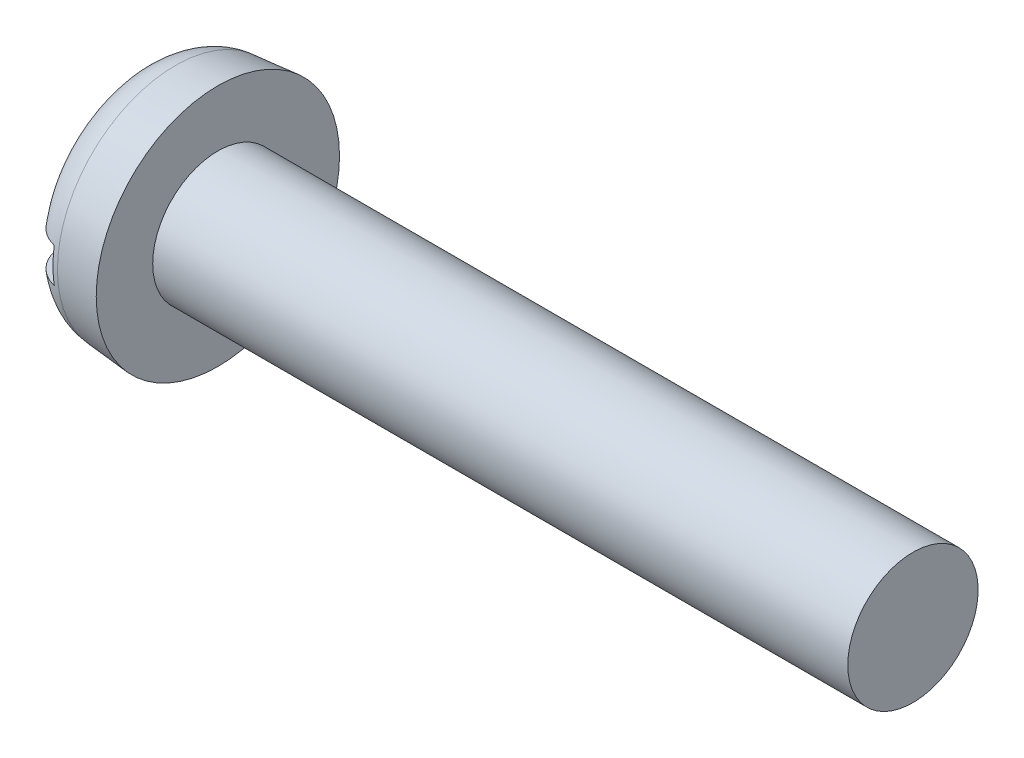
ISO-10303-21;
HEADER;
FILE_DESCRIPTION(('STEP AP214'),'2;1');
FILE_NAME('part.step','',(''),(''),'','','');
FILE_SCHEMA(('AUTOMOTIVE_DESIGN { 1 0 10303 214 1 1 1 1 }'));
ENDSEC;
DATA;
#1=APPLICATION_CONTEXT('core data for automotive mechanical design processes');
#2=APPLICATION_PROTOCOL_DEFINITION('international standard','automotive_design',2000,#1);
#3=PRODUCT_CONTEXT('',#1,'mechanical');
#4=PRODUCT('Part','Part','',(#3));
#5=PRODUCT_RELATED_PRODUCT_CATEGORY('part','',(#4));
#6=PRODUCT_DEFINITION_FORMATION('','',#4);
#7=PRODUCT_DEFINITION_CONTEXT('part definition',#1,'design');
#8=PRODUCT_DEFINITION('design','',#6,#7);
#9=PRODUCT_DEFINITION_SHAPE('','',#8);
#10=(LENGTH_UNIT() NAMED_UNIT(*) SI_UNIT(.MILLI.,.METRE.));
#11=(NAMED_UNIT(*) PLANE_ANGLE_UNIT() SI_UNIT($,.RADIAN.));
#12=(NAMED_UNIT(*) SI_UNIT($,.STERADIAN.) SOLID_ANGLE_UNIT());
#13=UNCERTAINTY_MEASURE_WITH_UNIT(LENGTH_MEASURE(1.E-05),#10,'distance_accuracy_value','');
#14=(GEOMETRIC_REPRESENTATION_CONTEXT(3) GLOBAL_UNCERTAINTY_ASSIGNED_CONTEXT((#13)) GLOBAL_UNIT_ASSIGNED_CONTEXT((#10,
#11,#12)) REPRESENTATION_CONTEXT('',''));
#15=CARTESIAN_POINT('',(0.,0.,0.));
#16=DIRECTION('',(0.,0.,1.));
#17=DIRECTION('',(1.,0.,0.));
#18=AXIS2_PLACEMENT_3D('',#15,#16,#17);
#19=CARTESIAN_POINT('',(0.,0.,0.));
#20=DIRECTION('',(-1.,0.,0.));
#21=DIRECTION('',(0.,0.,1.));
#22=AXIS2_PLACEMENT_3D('',#19,#20,#21);
#23=PLANE('',#22);
#24=DIRECTION('',(0.,0.,-1.));
#25=VECTOR('',#24,1.);
#26=CARTESIAN_POINT('',(0.,0.4,2.8));
#27=LINE('',#26,#25);
#28=CARTESIAN_POINT('',(0.,0.4,1.77326763142532));
#29=VERTEX_POINT('',#28);
#30=CARTESIAN_POINT('',(0.,0.4,-1.77326763142532));
#31=VERTEX_POINT('',#30);
#32=EDGE_CURVE('E88',#29,#31,#27,.T.);
#33=ORIENTED_EDGE('',*,*,#32,.F.);
#34=CARTESIAN_POINT('',(0.,0.,0.));
#35=DIRECTION('',(-1.,0.,0.));
#36=DIRECTION('',(0.,0.,1.));
#37=AXIS2_PLACEMENT_3D('',#34,#35,#36);
#38=CIRCLE('',#37,1.81782234903766);
#39=EDGE_CURVE('E94',#29,#31,#38,.T.);
#40=ORIENTED_EDGE('',*,*,#39,.T.);
#41=EDGE_LOOP('',(#33,#40));
#42=FACE_BOUND('',#41,.T.);
#43=ADVANCED_FACE('F35',(#42),#23,.T.);
#44=CARTESIAN_POINT('',(-25.4,0.,0.));
#45=DIRECTION('',(-1.,0.,0.));
#46=DIRECTION('',(0.,0.,1.));
#47=AXIS2_PLACEMENT_3D('',#44,#45,#46);
#48=CYLINDRICAL_SURFACE('',#47,1.5);
#49=CARTESIAN_POINT('',(17.8,0.,0.));
#50=DIRECTION('',(-1.,0.,0.));
#51=DIRECTION('',(0.,0.,1.));
#52=AXIS2_PLACEMENT_3D('',#49,#50,#51);
#53=CIRCLE('',#52,1.5);
#54=CARTESIAN_POINT('',(17.8,0.,1.5));
#55=VERTEX_POINT('',#54);
#56=EDGE_CURVE('E95',#55,#55,#53,.T.);
#57=ORIENTED_EDGE('',*,*,#56,.T.);
#58=EDGE_LOOP('',(#57));
#59=FACE_BOUND('',#58,.T.);
#60=CARTESIAN_POINT('',(1.8,0.,0.));
#61=DIRECTION('',(-1.,0.,0.));
#62=DIRECTION('',(0.,0.,1.));
#63=AXIS2_PLACEMENT_3D('',#60,#61,#62);
#64=CIRCLE('',#63,1.5);
#65=CARTESIAN_POINT('',(1.8,0.,1.5));
#66=VERTEX_POINT('',#65);
#67=EDGE_CURVE('E152',#66,#66,#64,.T.);
#68=ORIENTED_EDGE('',*,*,#67,.F.);
#69=EDGE_LOOP('',(#68));
#70=FACE_BOUND('',#69,.T.);
#71=ADVANCED_FACE('F140',(#59,#70),#48,.T.);
#72=CARTESIAN_POINT('',(17.8,1.5,0.));
#73=DIRECTION('',(1.,0.,0.));
#74=DIRECTION('',(0.,0.,-1.));
#75=AXIS2_PLACEMENT_3D('',#72,#73,#74);
#76=PLANE('',#75);
#77=ORIENTED_EDGE('',*,*,#56,.F.);
#78=EDGE_LOOP('',(#77));
#79=FACE_BOUND('',#78,.T.);
#80=ADVANCED_FACE('F138',(#79),#76,.T.);
#81=DIRECTION('',(0.,0.,1.));
#82=VECTOR('',#81,1.);
#83=CARTESIAN_POINT('',(0.,-0.4,-2.8));
#84=LINE('',#83,#82);
#85=CARTESIAN_POINT('',(0.,-0.4,-1.77326763142532));
#86=VERTEX_POINT('',#85);
#87=CARTESIAN_POINT('',(0.,-0.4,1.77326763142532));
#88=VERTEX_POINT('',#87);
#89=EDGE_CURVE('E79',#86,#88,#84,.T.);
#90=ORIENTED_EDGE('',*,*,#89,.F.);
#91=EDGE_CURVE('E86',#86,#88,#38,.T.);
#92=ORIENTED_EDGE('',*,*,#91,.T.);
#93=EDGE_LOOP('',(#90,#92));
#94=FACE_BOUND('',#93,.T.);
#95=ADVANCED_FACE('F85',(#94),#23,.T.);
#96=CARTESIAN_POINT('',(0.,0.,0.));
#97=DIRECTION('',(1.,0.,0.));
#98=DIRECTION('',(0.,0.,-1.));
#99=AXIS2_PLACEMENT_3D('',#96,#97,#98);
#100=CONICAL_SURFACE('',#99,2.64252040565334,0.0872664625997168);
#101=CARTESIAN_POINT('',(0.821559831527111,0.,0.));
#102=DIRECTION('',(-1.,0.,0.));
#103=DIRECTION('',(0.,0.,1.));
#104=AXIS2_PLACEMENT_3D('',#101,#102,#103);
#105=CIRCLE('',#104,2.71439757732023);
#106=CARTESIAN_POINT('',(0.821559831527111,0.,2.71439757732023));
#107=VERTEX_POINT('',#106);
#108=EDGE_CURVE('E98',#107,#107,#105,.F.);
#109=ORIENTED_EDGE('',*,*,#108,.T.);
#110=EDGE_LOOP('',(#109));
#111=FACE_BOUND('',#110,.T.);
#112=CARTESIAN_POINT('',(1.8,0.,0.));
#113=DIRECTION('',(-1.,0.,0.));
#114=DIRECTION('',(0.,0.,1.));
#115=AXIS2_PLACEMENT_3D('',#112,#113,#114);
#116=CIRCLE('',#115,2.8);
#117=CARTESIAN_POINT('',(1.8,0.,2.8));
#118=VERTEX_POINT('',#117);
#119=EDGE_CURVE('E100',#118,#118,#116,.T.);
#120=ORIENTED_EDGE('',*,*,#119,.T.);
#121=EDGE_LOOP('',(#120));
#122=FACE_BOUND('',#121,.T.);
#123=ADVANCED_FACE('F131',(#111,#122),#100,.T.);
#124=CARTESIAN_POINT('',(1.8,1.5,0.));
#125=DIRECTION('',(-1.,0.,0.));
#126=DIRECTION('',(0.,0.,1.));
#127=AXIS2_PLACEMENT_3D('',#124,#125,#126);
#128=PLANE('',#127);
#129=ORIENTED_EDGE('',*,*,#119,.F.);
#130=EDGE_LOOP('',(#129));
#131=FACE_BOUND('',#130,.T.);
#132=ORIENTED_EDGE('',*,*,#67,.T.);
#133=EDGE_LOOP('',(#132));
#134=FACE_BOUND('',#133,.T.);
#135=ADVANCED_FACE('F127',(#131,#134),#128,.F.);
#136=CARTESIAN_POINT('',(0.9,0.,0.));
#137=DIRECTION('',(-1.,0.,0.));
#138=DIRECTION('',(0.,0.,1.));
#139=AXIS2_PLACEMENT_3D('',#136,#137,#138);
#140=TOROIDAL_SURFACE('',#139,1.81782234903766,0.9);
#141=CARTESIAN_POINT('',(0.285780762477817,0.4,-2.44311963508101));
#142=CARTESIAN_POINT('',(0.322325244969282,0.4,-2.47769297217772));
#143=CARTESIAN_POINT('',(0.361794878156767,0.4,-2.50922544126929));
#144=CARTESIAN_POINT('',(0.445493757535043,0.4,-2.56525291577746));
#145=CARTESIAN_POINT('',(0.48972822484029,0.4,-2.58974009118149));
#146=CARTESIAN_POINT('',(0.581685294636184,0.4,-2.63091846199156));
#147=CARTESIAN_POINT('',(0.629407305379898,0.4,-2.64761097641683));
#148=CARTESIAN_POINT('',(0.726972312257169,0.4,-2.67270033258514));
#149=CARTESIAN_POINT('',(0.776814803129367,0.4,-2.68109913910669));
#150=CARTESIAN_POINT('',(0.876977038697279,0.4,-2.68933922206438));
#151=CARTESIAN_POINT('',(0.92729364560996,0.4,-2.68921866149007));
#152=CARTESIAN_POINT('',(1.02719093347253,0.4,-2.68051830929739));
#153=CARTESIAN_POINT('',(1.07677160162593,0.4,-2.67193837076201));
#154=CARTESIAN_POINT('',(1.17371760664879,0.4,-2.6465919807109));
#155=CARTESIAN_POINT('',(1.2210859954371,0.4,-2.62983719558013));
#156=CARTESIAN_POINT('',(1.31235127069059,0.4,-2.58864040768255));
#157=CARTESIAN_POINT('',(1.35624813968071,0.4,-2.56419836622246));
#158=CARTESIAN_POINT('',(1.43950339303332,0.4,-2.50824069345436));
#159=CARTESIAN_POINT('',(1.47884484993389,0.4,-2.47669988555644));
#160=CARTESIAN_POINT('',(1.55173067508121,0.4,-2.40751412200212));
#161=CARTESIAN_POINT('',(1.5852748745774,0.4,-2.36986898871862));
#162=CARTESIAN_POINT('',(1.64594872274809,0.4,-2.28919528368316));
#163=CARTESIAN_POINT('',(1.67301846569636,0.4,-2.24612167422176));
#164=CARTESIAN_POINT('',(1.71966197411636,0.4,-2.15609376898817));
#165=CARTESIAN_POINT('',(1.73923530584546,0.4,-2.10913924885738));
#166=CARTESIAN_POINT('',(1.77066025907209,0.4,-2.01194193646076));
#167=CARTESIAN_POINT('',(1.78239254664628,0.4,-1.96166058810882));
#168=CARTESIAN_POINT('',(1.7974373595853,0.4,-1.85985639013623));
#169=CARTESIAN_POINT('',(1.80074908437145,0.4,-1.80833342293966));
#170=CARTESIAN_POINT('',(1.79894832980293,0.4,-1.70434405475568));
#171=CARTESIAN_POINT('',(1.79365584590562,0.4,-1.651880798299));
#172=CARTESIAN_POINT('',(1.77456092354076,0.4,-1.54852841034414));
#173=CARTESIAN_POINT('',(1.76075741543224,0.4,-1.49763947754675));
#174=CARTESIAN_POINT('',(1.7246504916629,0.4,-1.3975266769579));
#175=CARTESIAN_POINT('',(1.70214283236717,0.4,-1.34837644263265));
#176=CARTESIAN_POINT('',(1.64933120824444,0.4,-1.25444995564252));
#177=CARTESIAN_POINT('',(1.6190255468442,0.4,-1.20967465773975));
#178=CARTESIAN_POINT('',(1.55085214424215,0.4,-1.12504927254803));
#179=CARTESIAN_POINT('',(1.51286662510254,0.4,-1.08529386793689));
#180=CARTESIAN_POINT('',(1.4306134165613,0.4,-1.01288372669284));
#181=CARTESIAN_POINT('',(1.38634513970435,0.4,-0.98022965477811));
#182=CARTESIAN_POINT('',(1.29378824575784,0.4,-0.924048107397016));
#183=CARTESIAN_POINT('',(1.24562231583718,0.4,-0.900319541839471));
#184=CARTESIAN_POINT('',(1.14574424072186,0.4,-0.862177327128565));
#185=CARTESIAN_POINT('',(1.09403573066562,0.4,-0.847754283110134));
#186=CARTESIAN_POINT('',(0.993395643106033,0.4,-0.830011922353258));
#187=CARTESIAN_POINT('',(0.944615271160061,0.4,-0.825833796085956));
#188=CARTESIAN_POINT('',(0.847107354416665,0.4,-0.826334878356685));
#189=CARTESIAN_POINT('',(0.798379798268946,0.4,-0.831011470142969));
#190=CARTESIAN_POINT('',(0.705495670608722,0.4,-0.848340731069384));
#191=CARTESIAN_POINT('',(0.661242330843084,0.4,-0.860484898174224));
#192=CARTESIAN_POINT('',(0.575232402842407,0.4,-0.891650416332973));
#193=CARTESIAN_POINT('',(0.53347652813922,0.4,-0.910673721938904));
#194=CARTESIAN_POINT('',(0.451191926076944,0.4,-0.956010770911779));
#195=CARTESIAN_POINT('',(0.41084895856706,0.4,-0.982660648611481));
#196=CARTESIAN_POINT('',(0.334722321142851,0.4,-1.04182188589593));
#197=CARTESIAN_POINT('',(0.298940164912517,0.4,-1.0743351828853));
#198=CARTESIAN_POINT('',(0.229649980616187,0.4,-1.14749226888793));
#199=CARTESIAN_POINT('',(0.196634914830279,0.4,-1.18860403936715));
#200=CARTESIAN_POINT('',(0.137645150810002,0.4,-1.27560624817727));
#201=CARTESIAN_POINT('',(0.111672172806045,0.4,-1.32149785033543));
#202=CARTESIAN_POINT('',(0.0665593590158842,0.4,-1.41881690272049));
#203=CARTESIAN_POINT('',(0.0477401615322292,0.4,-1.47039354331754));
#204=CARTESIAN_POINT('',(0.0191028447664946,0.4,-1.57598967955257));
#205=CARTESIAN_POINT('',(0.00928429911433809,0.4,-1.63000905934828));
#206=CARTESIAN_POINT('',(-0.000908845669418395,0.4,-1.73850050809585));
#207=CARTESIAN_POINT('',(-0.00135843890630447,0.4,-1.7929654882335));
#208=CARTESIAN_POINT('',(0.0071379486879365,0.4,-1.90117587148683));
#209=CARTESIAN_POINT('',(0.0160852351491476,0.4,-1.9549211735574));
#210=CARTESIAN_POINT('',(0.0428869469078852,0.4,-2.05874477252473));
#211=CARTESIAN_POINT('',(0.0605196216319731,0.4,-2.10888044427302));
#212=CARTESIAN_POINT('',(0.104140493725079,0.4,-2.20532358851202));
#213=CARTESIAN_POINT('',(0.130117020588857,0.4,-2.25163629510255));
#214=CARTESIAN_POINT('',(0.178150945787742,0.4,-2.32211375046635));
#215=CARTESIAN_POINT('',(0.197843641859489,0.4,-2.34792122195273));
#216=CARTESIAN_POINT('',(0.239879292580621,0.4,-2.39728022756983));
#217=CARTESIAN_POINT('',(0.26222221206527,0.4,-2.42083179162577));
#218=CARTESIAN_POINT('',(0.285780762477817,0.4,-2.44311963508101));
#219=B_SPLINE_CURVE_WITH_KNOTS('',3,(#141,#142,#143,#144,#145,#146,#147,#148,#149,#150,#151,
#152,#153,#154,#155,#156,#157,#158,#159,#160,#161,#162,#163,#164,#165,#166,#167,#168,#169,#170,
#171,#172,#173,#174,#175,#176,#177,#178,#179,#180,#181,#182,#183,#184,#185,#186,#187,#188,#189,
#190,#191,#192,#193,#194,#195,#196,#197,#198,#199,#200,#201,#202,#203,#204,#205,#206,#207,#208,
#209,#210,#211,#212,#213,#214,#215,#216,#217,#218),.UNSPECIFIED.,.T.,.F.,(4,2,2,2,2,2,2,2,2,2,2,
2,2,2,2,2,2,2,2,2,2,2,2,2,2,2,2,2,2,2,2,2,2,2,2,2,2,2,4),(0.,0.150804282209429,
0.301775523831159,0.452721208703323,0.603631125974155,0.753865076726384,0.904101636690626,
1.05412441728995,1.2041479530309,1.35471219197995,1.50528081291864,1.65719291262943,
1.80911380065295,1.96329712022902,2.11749509812026,2.27496068670365,2.43244606914274,
2.59387611122166,2.75534130458713,2.9195015653164,3.08367718561128,3.24389389244898,
3.40394859014677,3.55004213794101,3.69609251881817,3.83315592967566,3.97025831464732,
4.11470991133513,4.25920932580005,4.41668805635775,4.57420522099046,4.73812462607052,
4.90203626571949,5.06463536051201,5.22725705028985,5.38592661841767,5.54437521558828,
5.64159310397338,5.73880970255809),.UNSPECIFIED.);
#220=CARTESIAN_POINT('',(0.7,0.4,-2.66547244738019));
#221=VERTEX_POINT('',#220);
#222=EDGE_CURVE('E11',#31,#221,#219,.T.);
#223=ORIENTED_EDGE('',*,*,#222,.F.);
#224=ORIENTED_EDGE('',*,*,#39,.F.);
#225=CARTESIAN_POINT('',(0.356169071138295,0.4,1.02545886384317));
#226=CARTESIAN_POINT('',(0.394477383289829,0.4,0.994276095963573));
#227=CARTESIAN_POINT('',(0.435252098816795,0.4,0.966090537778846));
#228=CARTESIAN_POINT('',(0.520874070068605,0.4,0.916713010685472));
#229=CARTESIAN_POINT('',(0.565722974989389,0.4,0.895523890103121));
#230=CARTESIAN_POINT('',(0.658585145836014,0.4,0.861072215462474));
#231=CARTESIAN_POINT('',(0.706609437889925,0.4,0.84783908573147));
#232=CARTESIAN_POINT('',(0.804243253507339,0.4,0.83024223356215));
#233=CARTESIAN_POINT('',(0.853851628876229,0.4,0.825872228699233));
#234=CARTESIAN_POINT('',(0.950010182321422,0.4,0.826277197704913));
#235=CARTESIAN_POINT('',(0.996563474122619,0.4,0.830513937244102));
#236=CARTESIAN_POINT('',(1.08828168676608,0.4,0.846797595491544));
#237=CARTESIAN_POINT('',(1.1334463088223,0.4,0.858846182848628));
#238=CARTESIAN_POINT('',(1.22099947575276,0.4,0.890027753500388));
#239=CARTESIAN_POINT('',(1.26339999097867,0.4,0.909127417221131));
#240=CARTESIAN_POINT('',(1.34475562295769,0.4,0.953613660794996));
#241=CARTESIAN_POINT('',(1.38370973618203,0.4,0.979002063689565));
#242=CARTESIAN_POINT('',(1.4606297229717,0.4,1.03768873851847));
#243=CARTESIAN_POINT('',(1.49821861120609,0.4,1.07148126912977));
#244=CARTESIAN_POINT('',(1.56766557552966,0.4,1.14451739265722));
#245=CARTESIAN_POINT('',(1.59952174981566,0.4,1.18376278691406));
#246=CARTESIAN_POINT('',(1.65882951195037,0.4,1.26965174466254));
#247=CARTESIAN_POINT('',(1.68580874421987,0.4,1.3166225459502));
#248=CARTESIAN_POINT('',(1.7316261790846,0.4,1.41438438512647));
#249=CARTESIAN_POINT('',(1.7504634598458,0.4,1.46517585482832));
#250=CARTESIAN_POINT('',(1.77959171793735,0.4,1.56990546726));
#251=CARTESIAN_POINT('',(1.78976336496765,0.4,1.62387693551388));
#252=CARTESIAN_POINT('',(1.80070617985939,0.4,1.73276786407042));
#253=CARTESIAN_POINT('',(1.80147810121521,0.4,1.78768724803349));
#254=CARTESIAN_POINT('',(1.7935515731225,0.4,1.89576039323533));
#255=CARTESIAN_POINT('',(1.78503812714098,0.4,1.94892767588158));
#256=CARTESIAN_POINT('',(1.75897009134329,0.4,2.05299963181348));
#257=CARTESIAN_POINT('',(1.74141670948687,0.4,2.10390460641263));
#258=CARTESIAN_POINT('',(1.69825810143573,0.4,2.20064023444731));
#259=CARTESIAN_POINT('',(1.67286703477487,0.4,2.24656646381803));
#260=CARTESIAN_POINT('',(1.61458416704904,0.4,2.33338474929434));
#261=CARTESIAN_POINT('',(1.58169323312494,0.4,2.37427738654701));
#262=CARTESIAN_POINT('',(1.51007060998367,0.4,2.44900649357427));
#263=CARTESIAN_POINT('',(1.47146964140907,0.4,2.48296829636122));
#264=CARTESIAN_POINT('',(1.38904817001727,0.4,2.54382334084698));
#265=CARTESIAN_POINT('',(1.34522808158393,0.4,2.57071714318276));
#266=CARTESIAN_POINT('',(1.25424836231413,0.4,2.61630908807752));
#267=CARTESIAN_POINT('',(1.20714119293126,0.4,2.63511196373395));
#268=CARTESIAN_POINT('',(1.11042474691739,0.4,2.66447616047847));
#269=CARTESIAN_POINT('',(1.06081558875378,0.4,2.67503787139057));
#270=CARTESIAN_POINT('',(0.960893961973374,0.4,2.68755622717405));
#271=CARTESIAN_POINT('',(0.910589316471373,0.4,2.68957539390776));
#272=CARTESIAN_POINT('',(0.810358152757914,0.4,2.68512046084422));
#273=CARTESIAN_POINT('',(0.760431626986744,0.4,2.67864653130185));
#274=CARTESIAN_POINT('',(0.662478823238217,0.4,2.65741995217084));
#275=CARTESIAN_POINT('',(0.614448868329621,0.4,2.64268425826029));
#276=CARTESIAN_POINT('',(0.521534433162197,0.4,2.60538142887937));
#277=CARTESIAN_POINT('',(0.476649962619439,0.4,2.58281426921971));
#278=CARTESIAN_POINT('',(0.391148993047609,0.4,2.53043182461717));
#279=CARTESIAN_POINT('',(0.350545548527357,0.4,2.50059523892845));
#280=CARTESIAN_POINT('',(0.274874117650141,0.4,2.43457977439371));
#281=CARTESIAN_POINT('',(0.239806285839746,0.4,2.39840071853429));
#282=CARTESIAN_POINT('',(0.175879279186199,0.4,2.32042102737606));
#283=CARTESIAN_POINT('',(0.147073507775005,0.4,2.27857662814835));
#284=CARTESIAN_POINT('',(0.0967847753411474,0.4,2.19069995841567));
#285=CARTESIAN_POINT('',(0.07530224160311,0.4,2.14466744374764));
#286=CARTESIAN_POINT('',(0.0399276675747797,0.4,2.04903409979779));
#287=CARTESIAN_POINT('',(0.0261471165350434,0.4,1.99939205575588));
#288=CARTESIAN_POINT('',(0.00693602242391574,0.4,1.89852251200784));
#289=CARTESIAN_POINT('',(0.00150590448368233,0.4,1.84729493171548));
#290=CARTESIAN_POINT('',(-0.000985777473937043,0.4,1.74359522844075));
#291=CARTESIAN_POINT('',(0.00212519999965263,0.4,1.69111899279254));
#292=CARTESIAN_POINT('',(0.0168916821616578,0.4,1.58737297380086));
#293=CARTESIAN_POINT('',(0.0285499964789277,0.4,1.53610359288829));
#294=CARTESIAN_POINT('',(0.0604020950384818,0.4,1.43486374575567));
#295=CARTESIAN_POINT('',(0.0808043159051547,0.4,1.38495893538538));
#296=CARTESIAN_POINT('',(0.129530825890043,0.4,1.28921347783136));
#297=CARTESIAN_POINT('',(0.157849403934622,0.4,1.24336993202389));
#298=CARTESIAN_POINT('',(0.213684916145749,0.4,1.16773658539622));
#299=CARTESIAN_POINT('',(0.239651023875377,0.4,1.13678903007943));
#300=CARTESIAN_POINT('',(0.29525297901351,0.4,1.07838116842152));
#301=CARTESIAN_POINT('',(0.324888803246328,0.4,1.05092084005941));
#302=CARTESIAN_POINT('',(0.356169071138295,0.4,1.02545886384317));
#303=B_SPLINE_CURVE_WITH_KNOTS('',3,(#225,#226,#227,#228,#229,#230,#231,#232,#233,#234,#235,
#236,#237,#238,#239,#240,#241,#242,#243,#244,#245,#246,#247,#248,#249,#250,#251,#252,#253,#254,
#255,#256,#257,#258,#259,#260,#261,#262,#263,#264,#265,#266,#267,#268,#269,#270,#271,#272,#273,
#274,#275,#276,#277,#278,#279,#280,#281,#282,#283,#284,#285,#286,#287,#288,#289,#290,#291,#292,
#293,#294,#295,#296,#297,#298,#299,#300,#301,#302),.UNSPECIFIED.,.T.,.F.,(4,2,2,2,2,2,2,2,2,2,2,
2,2,2,2,2,2,2,2,2,2,2,2,2,2,2,2,2,2,2,2,2,2,2,2,2,2,2,4),(0.,0.148056677712979,
0.296173556814866,0.444834912477076,0.593390856036848,0.732942639414739,0.87252424155987,
1.01145452751666,1.15042513517956,1.30141738715291,1.45245963818336,1.61420969223844,
1.7759780548859,1.93993961693164,2.10388803551639,2.26462860972824,2.42534771058163,
2.5820147845557,2.73866375372932,2.89216335268838,3.04565077231286,3.19708679229202,
3.34851564860216,3.49883427697698,3.64914989207022,3.79915813668078,3.94916684463061,
4.09962050651671,4.25007836811616,4.40177296660437,4.55347641441351,4.70732244078731,
4.86117629939849,5.0181609530014,5.17519723279955,5.33620557401864,5.49709805791682,
5.61799301592463,5.73888721047272),.UNSPECIFIED.);
#304=CARTESIAN_POINT('',(0.7,0.4,2.66547244738019));
#305=VERTEX_POINT('',#304);
#306=EDGE_CURVE('E112',#305,#29,#303,.T.);
#307=ORIENTED_EDGE('',*,*,#306,.F.);
#308=CARTESIAN_POINT('',(0.7,0.,0.));
#309=DIRECTION('',(-1.,0.,0.));
#310=DIRECTION('',(0.,0.,1.));
#311=AXIS2_PLACEMENT_3D('',#308,#309,#310);
#312=CIRCLE('',#311,2.69531878777687);
#313=CARTESIAN_POINT('',(0.7,-0.4,2.66547244738019));
#314=VERTEX_POINT('',#313);
#315=EDGE_CURVE('E106',#305,#314,#312,.F.);
#316=ORIENTED_EDGE('',*,*,#315,.T.);
#317=CARTESIAN_POINT('',(0.356169071138295,-0.4,1.02545886384317));
#318=CARTESIAN_POINT('',(0.314031332279046,-0.4,1.05976167261355));
#319=CARTESIAN_POINT('',(0.274819372687131,-0.4,1.0977427449374));
#320=CARTESIAN_POINT('',(0.20326819432942,-0.4,1.17978565669674));
#321=CARTESIAN_POINT('',(0.170942545508555,-0.4,1.22385922524595));
#322=CARTESIAN_POINT('',(0.114111407238762,-0.4,1.31672727393884));
#323=CARTESIAN_POINT('',(0.0895968760226377,-0.4,1.36551620987613));
#324=CARTESIAN_POINT('',(0.0490785202121341,-0.4,1.46648183341045));
#325=CARTESIAN_POINT('',(0.0330703604686472,-0.4,1.51865678013273));
#326=CARTESIAN_POINT('',(0.0100453697545741,-0.4,1.62518908376032));
#327=CARTESIAN_POINT('',(0.00306618218707067,-0.4,1.67955460937645));
#328=CARTESIAN_POINT('',(-0.00144685561490171,-0.4,1.78868546318226));
#329=CARTESIAN_POINT('',(0.00101939609011308,-0.4,1.84345079568049));
#330=CARTESIAN_POINT('',(0.0152891480749748,-0.4,1.95052330416009));
#331=CARTESIAN_POINT('',(0.0268854930795697,-0.4,2.0028580557661));
#332=CARTESIAN_POINT('',(0.0589248901673074,-0.4,2.10474672243029));
#333=CARTESIAN_POINT('',(0.0793666318053631,-0.4,2.15430104818042));
#334=CARTESIAN_POINT('',(0.12795627217374,-0.4,2.24792186385266));
#335=CARTESIAN_POINT('',(0.155901237504733,-0.4,2.29209371256844));
#336=CARTESIAN_POINT('',(0.218944857951455,-0.4,2.37499861286517));
#337=CARTESIAN_POINT('',(0.254042725445853,-0.4,2.41373226246544));
#338=CARTESIAN_POINT('',(0.32966685096813,-0.4,2.48389534278566));
#339=CARTESIAN_POINT('',(0.370077637452011,-0.4,2.51544927894014));
#340=CARTESIAN_POINT('',(0.455677448683675,-0.4,2.57122459505542));
#341=CARTESIAN_POINT('',(0.50086612816506,-0.4,2.59544650436481));
#342=CARTESIAN_POINT('',(0.59413782417454,-0.4,2.6355729416184));
#343=CARTESIAN_POINT('',(0.642178527071037,-0.4,2.65157587103637));
#344=CARTESIAN_POINT('',(0.740273420359946,-0.4,2.67523109383666));
#345=CARTESIAN_POINT('',(0.790327524333045,-0.4,2.68288374523438));
#346=CARTESIAN_POINT('',(0.890686133385993,-0.4,2.68958762962226));
#347=CARTESIAN_POINT('',(0.940986998851126,-0.4,2.68869347246838));
#348=CARTESIAN_POINT('',(1.04072178380744,-0.4,2.67846167879018));
#349=CARTESIAN_POINT('',(1.0901557170213,-0.4,2.66912417603886));
#350=CARTESIAN_POINT('',(1.18669599164727,-0.4,2.64229877559468));
#351=CARTESIAN_POINT('',(1.23380501833184,-0.4,2.6248205362643));
#352=CARTESIAN_POINT('',(1.32443528846507,-0.4,2.58223220159563));
#353=CARTESIAN_POINT('',(1.36795650500275,-0.4,2.5571220490195));
#354=CARTESIAN_POINT('',(1.45036421793263,-0.4,2.49989362614525));
#355=CARTESIAN_POINT('',(1.48923230512215,-0.4,2.46774885590998));
#356=CARTESIAN_POINT('',(1.56107927302393,-0.4,2.39744378923729));
#357=CARTESIAN_POINT('',(1.59405796507024,-0.4,2.35928330016087));
#358=CARTESIAN_POINT('',(1.65352847250663,-0.4,2.2776666814067));
#359=CARTESIAN_POINT('',(1.67995797143492,-0.4,2.23416516156708));
#360=CARTESIAN_POINT('',(1.72526137908633,-0.4,2.14339421504175));
#361=CARTESIAN_POINT('',(1.74413484906926,-0.4,2.09612456975119));
#362=CARTESIAN_POINT('',(1.77411508290512,-0.4,1.9983989612356));
#363=CARTESIAN_POINT('',(1.78509960932637,-0.4,1.9479055243096));
#364=CARTESIAN_POINT('',(1.79862667184961,-0.4,1.84580292273346));
#365=CARTESIAN_POINT('',(1.80116838107033,-0.4,1.79419364929756));
#366=CARTESIAN_POINT('',(1.79780993826834,-0.4,1.69014314952536));
#367=CARTESIAN_POINT('',(1.79172746900389,-0.4,1.63770783465182));
#368=CARTESIAN_POINT('',(1.77106806778027,-0.4,1.53454005861514));
#369=CARTESIAN_POINT('',(1.75649007103968,-0.4,1.48380781174802));
#370=CARTESIAN_POINT('',(1.7188487103298,-0.4,1.38413781596447));
#371=CARTESIAN_POINT('',(1.69558194660123,-0.4,1.33527684770509));
#372=CARTESIAN_POINT('',(1.64130257902653,-0.4,1.24205401456033));
#373=CARTESIAN_POINT('',(1.6102882125599,-0.4,1.19769317671197));
#374=CARTESIAN_POINT('',(1.54078360718032,-0.4,1.11407031283595));
#375=CARTESIAN_POINT('',(1.50218355419827,-0.4,1.07489936013486));
#376=CARTESIAN_POINT('',(1.41879382359701,-0.4,1.00377929202409));
#377=CARTESIAN_POINT('',(1.37400377230517,-0.4,0.971830612909673));
#378=CARTESIAN_POINT('',(1.28066227969846,-0.4,0.917245549760186));
#379=CARTESIAN_POINT('',(1.23224470963451,-0.4,0.894381439836964));
#380=CARTESIAN_POINT('',(1.13202516716603,-0.4,0.858023892867302));
#381=CARTESIAN_POINT('',(1.08022692076976,-0.4,0.844520323748755));
#382=CARTESIAN_POINT('',(0.979686768939646,-0.4,0.828554710074538));
#383=CARTESIAN_POINT('',(0.931083582720591,-0.4,0.82521631591368));
#384=CARTESIAN_POINT('',(0.834057576527118,-0.4,0.827306267768065));
#385=CARTESIAN_POINT('',(0.785634764475608,-0.4,0.832734994430688));
#386=CARTESIAN_POINT('',(0.693219129123408,-0.4,0.851440182721389));
#387=CARTESIAN_POINT('',(0.6491307615266,-0.4,0.864254528165209));
#388=CARTESIAN_POINT('',(0.563580966367806,-0.4,0.896690334746237));
#389=CARTESIAN_POINT('',(0.522117110679347,-0.4,0.916305391888431));
#390=CARTESIAN_POINT('',(0.460201335026829,-0.4,0.951554535089635));
#391=CARTESIAN_POINT('',(0.438547037771904,-0.4,0.965129512636782));
#392=CARTESIAN_POINT('',(0.396436028831446,-0.4,0.994018383793284));
#393=CARTESIAN_POINT('',(0.375979221006585,-0.4,1.00933213751562));
#394=CARTESIAN_POINT('',(0.356169071138295,-0.4,1.02545886384317));
#395=B_SPLINE_CURVE_WITH_KNOTS('',3,(#317,#318,#319,#320,#321,#322,#323,#324,#325,#326,#327,
#328,#329,#330,#331,#332,#333,#334,#335,#336,#337,#338,#339,#340,#341,#342,#343,#344,#345,#346,
#347,#348,#349,#350,#351,#352,#353,#354,#355,#356,#357,#358,#359,#360,#361,#362,#363,#364,#365,
#366,#367,#368,#369,#370,#371,#372,#373,#374,#375,#376,#377,#378,#379,#380,#381,#382,#383,#384,
#385,#386,#387,#388,#389,#390,#391,#392,#393,#394),.UNSPECIFIED.,.T.,.F.,(4,2,2,2,2,2,2,2,2,2,2,
2,2,2,2,2,2,2,2,2,2,2,2,2,2,2,2,2,2,2,2,2,2,2,2,2,2,2,4),(0.,0.162908543977832,
0.326135200101453,0.489172220791498,0.652126072139755,0.815757140806174,0.979389975458609,
1.13941349616251,1.29941331750199,1.45545894016543,1.61148738958683,1.76455910424509,
1.91761976498379,2.068802492645,2.21997873814259,2.37018969158947,2.52039826519579,
2.67042907998157,2.82046101999671,2.97106818075077,3.12168016531919,3.27367450756494,
3.42567767407005,3.5799880622519,3.73431356299688,3.89195060675763,4.04960741210517,
4.2112132976058,4.37285598283535,4.5370386362033,4.70123120514444,4.86099956435944,
5.02059471531597,5.16597452097208,5.31136063884072,5.44850857150574,5.58552770590542,
5.66212180496716,5.73870974628516),.UNSPECIFIED.);
#396=EDGE_CURVE('E93',#88,#314,#395,.T.);
#397=ORIENTED_EDGE('',*,*,#396,.F.);
#398=ORIENTED_EDGE('',*,*,#91,.F.);
#399=CARTESIAN_POINT('',(0.285780762477817,-0.4,-2.44311963508101));
#400=CARTESIAN_POINT('',(0.248557143829482,-0.4,-2.4078972812164));
#401=CARTESIAN_POINT('',(0.21431245236119,-0.4,-2.3694650707352));
#402=CARTESIAN_POINT('',(0.152768043532584,-0.4,-2.28733938194963));
#403=CARTESIAN_POINT('',(0.125478130377416,-0.4,-2.24363860286105));
#404=CARTESIAN_POINT('',(0.0786257158649476,-0.4,-2.15234079857027));
#405=CARTESIAN_POINT('',(0.0590537929026404,-0.4,-2.10474861000723));
#406=CARTESIAN_POINT('',(0.0280650821156157,-0.4,-2.00700047851119));
#407=CARTESIAN_POINT('',(0.0166461813020745,-0.4,-1.95684520345737));
#408=CARTESIAN_POINT('',(0.00206923204411924,-0.4,-1.85464080389292));
#409=CARTESIAN_POINT('',(-0.000972085111053216,-0.4,-1.80257506295451));
#410=CARTESIAN_POINT('',(0.00151453147792929,-0.4,-1.69864852440772));
#411=CARTESIAN_POINT('',(0.00704382880236595,-0.4,-1.64678776072725));
#412=CARTESIAN_POINT('',(0.0266516864050342,-0.4,-1.5434240201059));
#413=CARTESIAN_POINT('',(0.0409314131746844,-0.4,-1.49195921679783));
#414=CARTESIAN_POINT('',(0.0777275151672627,-0.4,-1.39206285915813));
#415=CARTESIAN_POINT('',(0.100245079836245,-0.4,-1.34363174403842));
#416=CARTESIAN_POINT('',(0.153482972183088,-0.4,-1.2500005252344));
#417=CARTESIAN_POINT('',(0.184382352554496,-0.4,-1.20490211419648));
#418=CARTESIAN_POINT('',(0.253306595403157,-0.4,-1.12049761259773));
#419=CARTESIAN_POINT('',(0.291333458753369,-0.4,-1.08119315410127));
#420=CARTESIAN_POINT('',(0.373599819825438,-0.4,-1.00962170698056));
#421=CARTESIAN_POINT('',(0.417845144124488,-0.4,-0.977361391817105));
#422=CARTESIAN_POINT('',(0.511393224424661,-0.4,-0.921257408160295));
#423=CARTESIAN_POINT('',(0.560693424544353,-0.4,-0.897409512943095));
#424=CARTESIAN_POINT('',(0.659899494014213,-0.4,-0.86056620148907));
#425=CARTESIAN_POINT('',(0.70959665550847,-0.4,-0.847011806093055));
#426=CARTESIAN_POINT('',(0.81063175641273,-0.4,-0.829407026781007));
#427=CARTESIAN_POINT('',(0.861968199741098,-0.4,-0.825348214635538));
#428=CARTESIAN_POINT('',(0.959752077480286,-0.4,-0.82693832731787));
#429=CARTESIAN_POINT('',(1.00621575887746,-0.4,-0.831730406017744));
#430=CARTESIAN_POINT('',(1.09766854953413,-0.4,-0.849077179323799));
#431=CARTESIAN_POINT('',(1.14265739171951,-0.4,-0.861633271803835));
#432=CARTESIAN_POINT('',(1.2299114176728,-0.4,-0.893807868219966));
#433=CARTESIAN_POINT('',(1.27218175788193,-0.4,-0.913412506998421));
#434=CARTESIAN_POINT('',(1.35320643219735,-0.4,-0.958874855551496));
#435=CARTESIAN_POINT('',(1.39195973961517,-0.4,-0.984734383223624));
#436=CARTESIAN_POINT('',(1.46843970297676,-0.4,-1.04440221898529));
#437=CARTESIAN_POINT('',(1.5057776319984,-0.4,-1.07870901508261));
#438=CARTESIAN_POINT('',(1.57463408911242,-0.4,-1.15273784634507));
#439=CARTESIAN_POINT('',(1.60615068897795,-0.4,-1.19246166827117));
#440=CARTESIAN_POINT('',(1.66460952025841,-0.4,-1.27921419766999));
#441=CARTESIAN_POINT('',(1.69108592858502,-0.4,-1.32655784594953));
#442=CARTESIAN_POINT('',(1.73582713929311,-0.4,-1.42498260596115));
#443=CARTESIAN_POINT('',(1.75409110005355,-0.4,-1.47606410012852));
#444=CARTESIAN_POINT('',(1.7819800651308,-0.4,-1.58118959955467));
#445=CARTESIAN_POINT('',(1.79150042969761,-0.4,-1.63526148025197));
#446=CARTESIAN_POINT('',(1.80112725488866,-0.4,-1.74424014808114));
#447=CARTESIAN_POINT('',(1.80123449731023,-0.4,-1.79914686549765));
#448=CARTESIAN_POINT('',(1.79200090917881,-0.4,-1.90704889801334));
#449=CARTESIAN_POINT('',(1.78285023172313,-0.4,-1.96006044029451));
#450=CARTESIAN_POINT('',(1.75554489311913,-0.4,-2.06371351442585));
#451=CARTESIAN_POINT('',(1.73739144905737,-0.4,-2.11435536562275));
#452=CARTESIAN_POINT('',(1.69310212999213,-0.4,-2.21047686976185));
#453=CARTESIAN_POINT('',(1.66717834059447,-0.4,-2.25605427430112));
#454=CARTESIAN_POINT('',(1.60789945686383,-0.4,-2.34209023989538));
#455=CARTESIAN_POINT('',(1.57454519739076,-0.4,-2.38254937521993));
#456=CARTESIAN_POINT('',(1.50207992140168,-0.4,-2.45635864078367));
#457=CARTESIAN_POINT('',(1.46309647311969,-0.4,-2.48983406282631));
#458=CARTESIAN_POINT('',(1.37999946341266,-0.4,-2.54966020191344));
#459=CARTESIAN_POINT('',(1.33588629200968,-0.4,-2.57601146011503));
#460=CARTESIAN_POINT('',(1.24441048294309,-0.4,-2.6204920842224));
#461=CARTESIAN_POINT('',(1.19709806498187,-0.4,-2.63872477396665));
#462=CARTESIAN_POINT('',(1.10007286159794,-0.4,-2.66692299241135));
#463=CARTESIAN_POINT('',(1.05036028930681,-0.4,-2.67688925373976));
#464=CARTESIAN_POINT('',(0.950330778412724,-0.4,-2.68821568147498));
#465=CARTESIAN_POINT('',(0.900020830724849,-0.4,-2.68963769422185));
#466=CARTESIAN_POINT('',(0.799864722777445,-0.4,-2.68399705480249));
#467=CARTESIAN_POINT('',(0.750018680334321,-0.4,-2.67693230351107));
#468=CARTESIAN_POINT('',(0.652295079642407,-0.4,-2.6545442288954));
#469=CARTESIAN_POINT('',(0.604414938079601,-0.4,-2.63923214293824));
#470=CARTESIAN_POINT('',(0.511939743577346,-0.4,-2.60081753553039));
#471=CARTESIAN_POINT('',(0.467340561615687,-0.4,-2.5777250172516));
#472=CARTESIAN_POINT('',(0.400101785238431,-0.4,-2.53543999984867));
#473=CARTESIAN_POINT('',(0.375979970292489,-0.4,-2.51855507086787));
#474=CARTESIAN_POINT('',(0.329505055171142,-0.4,-2.48250598020391));
#475=CARTESIAN_POINT('',(0.307151944649364,-0.4,-2.46334183185513));
#476=CARTESIAN_POINT('',(0.285780762477817,-0.4,-2.44311963508101));
#477=B_SPLINE_CURVE_WITH_KNOTS('',3,(#399,#400,#401,#402,#403,#404,#405,#406,#407,#408,#409,
#410,#411,#412,#413,#414,#415,#416,#417,#418,#419,#420,#421,#422,#423,#424,#425,#426,#427,#428,
#429,#430,#431,#432,#433,#434,#435,#436,#437,#438,#439,#440,#441,#442,#443,#444,#445,#446,#447,
#448,#449,#450,#451,#452,#453,#454,#455,#456,#457,#458,#459,#460,#461,#462,#463,#464,#465,#466,
#467,#468,#469,#470,#471,#472,#473,#474,#475,#476),.UNSPECIFIED.,.T.,.F.,(4,2,2,2,2,2,2,2,2,2,2,
2,2,2,2,2,2,2,2,2,2,2,2,2,2,2,2,2,2,2,2,2,2,2,2,2,2,2,4),(0.,0.153630076563003,0.30747554336492,
0.461132620212027,0.614749859849374,0.770496992161263,0.926268906303976,1.08576372212915,
1.24528157620828,1.40851960556979,1.57180352898442,1.73524147908282,1.89859719430262,
2.05228040591997,2.205827157294,2.34528036488284,2.48475868767391,2.62396413120245,
2.7632100815968,2.91467905032863,3.06619810123316,3.22817436288511,3.39016722026913,
3.55407439716564,3.71796796090444,3.87856222841603,4.03913479105936,4.19567175163465,
4.35219113316334,4.50560019509845,4.65899760068397,4.81038266514853,4.96175431138951,
5.1120289424741,5.26234075029904,5.41244826767269,5.56236352612232,5.65056762019062,
5.73877119825418),.UNSPECIFIED.);
#478=CARTESIAN_POINT('',(0.7,-0.4,-2.66547244738019));
#479=VERTEX_POINT('',#478);
#480=EDGE_CURVE('E47',#479,#86,#477,.T.);
#481=ORIENTED_EDGE('',*,*,#480,.F.);
#482=EDGE_CURVE('E59',#479,#221,#312,.F.);
#483=ORIENTED_EDGE('',*,*,#482,.T.);
#484=EDGE_LOOP('',(#223,#224,#307,#316,#397,#398,#481,#483));
#485=FACE_BOUND('',#484,.T.);
#486=ORIENTED_EDGE('',*,*,#108,.F.);
#487=EDGE_LOOP('',(#486));
#488=FACE_BOUND('',#487,.T.);
#489=ADVANCED_FACE('F37',(#485,#488),#140,.T.);
#490=CARTESIAN_POINT('',(0.7,0.4,2.8));
#491=DIRECTION('',(0.,1.,0.));
#492=DIRECTION('',(0.,0.,1.));
#493=AXIS2_PLACEMENT_3D('',#490,#491,#492);
#494=PLANE('',#493);
#495=ORIENTED_EDGE('',*,*,#222,.T.);
#496=DIRECTION('',(0.,0.,-1.));
#497=VECTOR('',#496,1.);
#498=CARTESIAN_POINT('',(0.7,0.4,2.8));
#499=LINE('',#498,#497);
#500=EDGE_CURVE('E87',#305,#221,#499,.T.);
#501=ORIENTED_EDGE('',*,*,#500,.F.);
#502=ORIENTED_EDGE('',*,*,#306,.T.);
#503=ORIENTED_EDGE('',*,*,#32,.T.);
#504=EDGE_LOOP('',(#495,#501,#502,#503));
#505=FACE_BOUND('',#504,.T.);
#506=ADVANCED_FACE('F119',(#505),#494,.F.);
#507=CARTESIAN_POINT('',(0.7,-0.4,-2.8));
#508=DIRECTION('',(0.,-1.,0.));
#509=DIRECTION('',(0.,0.,-1.));
#510=AXIS2_PLACEMENT_3D('',#507,#508,#509);
#511=PLANE('',#510);
#512=ORIENTED_EDGE('',*,*,#480,.T.);
#513=ORIENTED_EDGE('',*,*,#89,.T.);
#514=ORIENTED_EDGE('',*,*,#396,.T.);
#515=DIRECTION('',(0.,0.,1.));
#516=VECTOR('',#515,1.);
#517=CARTESIAN_POINT('',(0.7,-0.4,-2.8));
#518=LINE('',#517,#516);
#519=EDGE_CURVE('E54',#479,#314,#518,.T.);
#520=ORIENTED_EDGE('',*,*,#519,.F.);
#521=EDGE_LOOP('',(#512,#513,#514,#520));
#522=FACE_BOUND('',#521,.T.);
#523=ADVANCED_FACE('F78',(#522),#511,.F.);
#524=CARTESIAN_POINT('',(0.7,0.4,-2.8));
#525=DIRECTION('',(-1.,0.,0.));
#526=DIRECTION('',(0.,0.,1.));
#527=AXIS2_PLACEMENT_3D('',#524,#525,#526);
#528=PLANE('',#527);
#529=ORIENTED_EDGE('',*,*,#519,.T.);
#530=ORIENTED_EDGE('',*,*,#315,.F.);
#531=ORIENTED_EDGE('',*,*,#500,.T.);
#532=ORIENTED_EDGE('',*,*,#482,.F.);
#533=EDGE_LOOP('',(#529,#530,#531,#532));
#534=FACE_BOUND('',#533,.T.);
#535=ADVANCED_FACE('F118',(#534),#528,.T.);
#536=CLOSED_SHELL('',(#43,#71,#80,#95,#123,#135,#489,#506,#523,#535));
#537=MANIFOLD_SOLID_BREP('B2',#536);
#538=ADVANCED_BREP_SHAPE_REPRESENTATION('',(#18,#537),#14);
#539=SHAPE_DEFINITION_REPRESENTATION(#9,#538);
ENDSEC;
END-ISO-10303-21;
